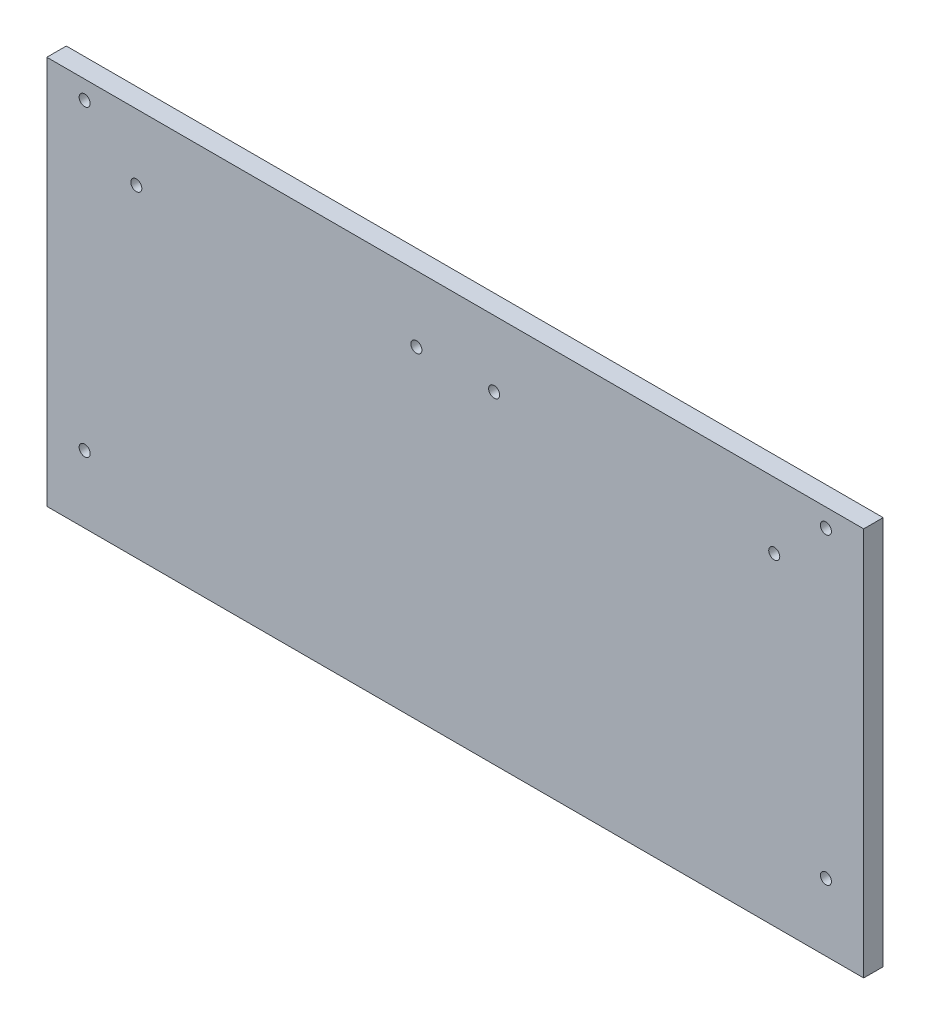
ISO-10303-21;
HEADER;
FILE_DESCRIPTION(('STEP AP214'),'2;1');
FILE_NAME('part.step','',(''),(''),'','','');
FILE_SCHEMA(('AUTOMOTIVE_DESIGN { 1 0 10303 214 1 1 1 1 }'));
ENDSEC;
DATA;
#1=APPLICATION_CONTEXT('core data for automotive mechanical design processes');
#2=APPLICATION_PROTOCOL_DEFINITION('international standard','automotive_design',2000,#1);
#3=PRODUCT_CONTEXT('',#1,'mechanical');
#4=PRODUCT('Part','Part','',(#3));
#5=PRODUCT_RELATED_PRODUCT_CATEGORY('part','',(#4));
#6=PRODUCT_DEFINITION_FORMATION('','',#4);
#7=PRODUCT_DEFINITION_CONTEXT('part definition',#1,'design');
#8=PRODUCT_DEFINITION('design','',#6,#7);
#9=PRODUCT_DEFINITION_SHAPE('','',#8);
#10=(LENGTH_UNIT() NAMED_UNIT(*) SI_UNIT(.MILLI.,.METRE.));
#11=(NAMED_UNIT(*) PLANE_ANGLE_UNIT() SI_UNIT($,.RADIAN.));
#12=(NAMED_UNIT(*) SI_UNIT($,.STERADIAN.) SOLID_ANGLE_UNIT());
#13=UNCERTAINTY_MEASURE_WITH_UNIT(LENGTH_MEASURE(1.E-05),#10,'distance_accuracy_value','');
#14=(GEOMETRIC_REPRESENTATION_CONTEXT(3) GLOBAL_UNCERTAINTY_ASSIGNED_CONTEXT((#13)) GLOBAL_UNIT_ASSIGNED_CONTEXT((#10,
#11,#12)) REPRESENTATION_CONTEXT('',''));
#15=CARTESIAN_POINT('',(0.,0.,0.));
#16=DIRECTION('',(0.,0.,1.));
#17=DIRECTION('',(1.,0.,0.));
#18=AXIS2_PLACEMENT_3D('',#15,#16,#17);
#19=CARTESIAN_POINT('',(0.,0.,0.));
#20=DIRECTION('',(0.,0.,-1.));
#21=DIRECTION('',(-1.,0.,0.));
#22=AXIS2_PLACEMENT_3D('',#19,#20,#21);
#23=PLANE('',#22);
#24=CARTESIAN_POINT('',(146.05,105.41,0.));
#25=DIRECTION('',(0.,0.,1.));
#26=DIRECTION('',(1.,0.,0.));
#27=AXIS2_PLACEMENT_3D('',#24,#25,#26);
#28=CIRCLE('',#27,1.8);
#29=CARTESIAN_POINT('',(147.85,105.41,0.));
#30=VERTEX_POINT('',#29);
#31=EDGE_CURVE('E144',#30,#30,#28,.T.);
#32=ORIENTED_EDGE('',*,*,#31,.T.);
#33=EDGE_LOOP('',(#32));
#34=FACE_BOUND('',#33,.T.);
#35=CARTESIAN_POINT('',(237.49,105.41,0.));
#36=DIRECTION('',(0.,0.,1.));
#37=DIRECTION('',(1.,0.,0.));
#38=AXIS2_PLACEMENT_3D('',#35,#36,#37);
#39=CIRCLE('',#38,1.8);
#40=CARTESIAN_POINT('',(239.29,105.41,0.));
#41=VERTEX_POINT('',#40);
#42=EDGE_CURVE('E138',#41,#41,#39,.T.);
#43=ORIENTED_EDGE('',*,*,#42,.T.);
#44=EDGE_LOOP('',(#43));
#45=FACE_BOUND('',#44,.T.);
#46=CARTESIAN_POINT('',(12.3444,121.0056,0.));
#47=DIRECTION('',(0.,0.,1.));
#48=DIRECTION('',(1.,0.,0.));
#49=AXIS2_PLACEMENT_3D('',#46,#47,#48);
#50=CIRCLE('',#49,1.8);
#51=CARTESIAN_POINT('',(14.1444,121.0056,0.));
#52=VERTEX_POINT('',#51);
#53=EDGE_CURVE('E132',#52,#52,#50,.T.);
#54=ORIENTED_EDGE('',*,*,#53,.T.);
#55=EDGE_LOOP('',(#54));
#56=FACE_BOUND('',#55,.T.);
#57=CARTESIAN_POINT('',(12.3444,21.9964,0.));
#58=DIRECTION('',(0.,0.,1.));
#59=DIRECTION('',(1.,0.,0.));
#60=AXIS2_PLACEMENT_3D('',#57,#58,#59);
#61=CIRCLE('',#60,1.8);
#62=CARTESIAN_POINT('',(14.1444,21.9964,0.));
#63=VERTEX_POINT('',#62);
#64=EDGE_CURVE('E126',#63,#63,#61,.T.);
#65=ORIENTED_EDGE('',*,*,#64,.T.);
#66=EDGE_LOOP('',(#65));
#67=FACE_BOUND('',#66,.T.);
#68=CARTESIAN_POINT('',(254.3556,21.9964,0.));
#69=DIRECTION('',(0.,0.,1.));
#70=DIRECTION('',(1.,0.,0.));
#71=AXIS2_PLACEMENT_3D('',#68,#69,#70);
#72=CIRCLE('',#71,1.80000000000002);
#73=CARTESIAN_POINT('',(256.1556,21.9964,0.));
#74=VERTEX_POINT('',#73);
#75=EDGE_CURVE('E120',#74,#74,#72,.T.);
#76=ORIENTED_EDGE('',*,*,#75,.T.);
#77=EDGE_LOOP('',(#76));
#78=FACE_BOUND('',#77,.T.);
#79=CARTESIAN_POINT('',(254.3556,121.0056,0.));
#80=DIRECTION('',(0.,0.,1.));
#81=DIRECTION('',(1.,0.,0.));
#82=AXIS2_PLACEMENT_3D('',#79,#80,#81);
#83=CIRCLE('',#82,1.80000000000002);
#84=CARTESIAN_POINT('',(256.1556,121.0056,0.));
#85=VERTEX_POINT('',#84);
#86=EDGE_CURVE('E104',#85,#85,#83,.T.);
#87=ORIENTED_EDGE('',*,*,#86,.T.);
#88=EDGE_LOOP('',(#87));
#89=FACE_BOUND('',#88,.T.);
#90=DIRECTION('',(0.,-1.,0.));
#91=VECTOR('',#90,1.);
#92=CARTESIAN_POINT('',(0.,127.,0.));
#93=LINE('',#92,#91);
#94=CARTESIAN_POINT('',(0.,127.,0.));
#95=VERTEX_POINT('',#94);
#96=CARTESIAN_POINT('',(0.,0.,0.));
#97=VERTEX_POINT('',#96);
#98=EDGE_CURVE('E101',#95,#97,#93,.T.);
#99=ORIENTED_EDGE('',*,*,#98,.F.);
#100=DIRECTION('',(-1.,0.,0.));
#101=VECTOR('',#100,1.);
#102=CARTESIAN_POINT('',(266.7,127.,0.));
#103=LINE('',#102,#101);
#104=CARTESIAN_POINT('',(266.7,127.,0.));
#105=VERTEX_POINT('',#104);
#106=EDGE_CURVE('E76',#105,#95,#103,.T.);
#107=ORIENTED_EDGE('',*,*,#106,.F.);
#108=DIRECTION('',(0.,1.,0.));
#109=VECTOR('',#108,1.);
#110=CARTESIAN_POINT('',(266.7,127.,0.));
#111=LINE('',#110,#109);
#112=CARTESIAN_POINT('',(266.7,0.,0.));
#113=VERTEX_POINT('',#112);
#114=EDGE_CURVE('E70',#113,#105,#111,.T.);
#115=ORIENTED_EDGE('',*,*,#114,.F.);
#116=DIRECTION('',(1.,0.,0.));
#117=VECTOR('',#116,1.);
#118=CARTESIAN_POINT('',(266.7,0.,0.));
#119=LINE('',#118,#117);
#120=EDGE_CURVE('E93',#97,#113,#119,.T.);
#121=ORIENTED_EDGE('',*,*,#120,.F.);
#122=EDGE_LOOP('',(#99,#107,#115,#121));
#123=FACE_BOUND('',#122,.T.);
#124=CARTESIAN_POINT('',(120.65,105.41,0.));
#125=DIRECTION('',(0.,0.,1.));
#126=DIRECTION('',(1.,0.,0.));
#127=AXIS2_PLACEMENT_3D('',#124,#125,#126);
#128=CIRCLE('',#127,1.8);
#129=CARTESIAN_POINT('',(122.45,105.41,0.));
#130=VERTEX_POINT('',#129);
#131=EDGE_CURVE('E150',#130,#130,#128,.T.);
#132=ORIENTED_EDGE('',*,*,#131,.T.);
#133=EDGE_LOOP('',(#132));
#134=FACE_BOUND('',#133,.T.);
#135=CARTESIAN_POINT('',(29.21,105.41,0.));
#136=DIRECTION('',(0.,0.,1.));
#137=DIRECTION('',(1.,0.,0.));
#138=AXIS2_PLACEMENT_3D('',#135,#136,#137);
#139=CIRCLE('',#138,1.8);
#140=CARTESIAN_POINT('',(31.01,105.41,0.));
#141=VERTEX_POINT('',#140);
#142=EDGE_CURVE('E156',#141,#141,#139,.T.);
#143=ORIENTED_EDGE('',*,*,#142,.T.);
#144=EDGE_LOOP('',(#143));
#145=FACE_BOUND('',#144,.T.);
#146=ADVANCED_FACE('F36',(#34,#45,#56,#67,#78,#89,#123,#134,#145),#23,.T.);
#147=CARTESIAN_POINT('',(0.,0.,6.35));
#148=DIRECTION('',(0.,0.,-1.));
#149=DIRECTION('',(-1.,0.,0.));
#150=AXIS2_PLACEMENT_3D('',#147,#148,#149);
#151=PLANE('',#150);
#152=CARTESIAN_POINT('',(29.21,105.41,6.35));
#153=DIRECTION('',(0.,0.,1.));
#154=DIRECTION('',(1.,0.,0.));
#155=AXIS2_PLACEMENT_3D('',#152,#153,#154);
#156=CIRCLE('',#155,1.79999999999999);
#157=CARTESIAN_POINT('',(31.01,105.41,6.35));
#158=VERTEX_POINT('',#157);
#159=EDGE_CURVE('E159',#158,#158,#156,.T.);
#160=ORIENTED_EDGE('',*,*,#159,.F.);
#161=EDGE_LOOP('',(#160));
#162=FACE_BOUND('',#161,.T.);
#163=CARTESIAN_POINT('',(146.05,105.41,6.35));
#164=DIRECTION('',(0.,0.,1.));
#165=DIRECTION('',(1.,0.,0.));
#166=AXIS2_PLACEMENT_3D('',#163,#164,#165);
#167=CIRCLE('',#166,1.8);
#168=CARTESIAN_POINT('',(147.85,105.41,6.35));
#169=VERTEX_POINT('',#168);
#170=EDGE_CURVE('E147',#169,#169,#167,.T.);
#171=ORIENTED_EDGE('',*,*,#170,.F.);
#172=EDGE_LOOP('',(#171));
#173=FACE_BOUND('',#172,.T.);
#174=CARTESIAN_POINT('',(237.49,105.41,6.35));
#175=DIRECTION('',(0.,0.,1.));
#176=DIRECTION('',(1.,0.,0.));
#177=AXIS2_PLACEMENT_3D('',#174,#175,#176);
#178=CIRCLE('',#177,1.8);
#179=CARTESIAN_POINT('',(239.29,105.41,6.35));
#180=VERTEX_POINT('',#179);
#181=EDGE_CURVE('E141',#180,#180,#178,.T.);
#182=ORIENTED_EDGE('',*,*,#181,.F.);
#183=EDGE_LOOP('',(#182));
#184=FACE_BOUND('',#183,.T.);
#185=CARTESIAN_POINT('',(12.3444,121.0056,6.35));
#186=DIRECTION('',(0.,0.,1.));
#187=DIRECTION('',(1.,0.,0.));
#188=AXIS2_PLACEMENT_3D('',#185,#186,#187);
#189=CIRCLE('',#188,1.8);
#190=CARTESIAN_POINT('',(14.1444,121.0056,6.35));
#191=VERTEX_POINT('',#190);
#192=EDGE_CURVE('E135',#191,#191,#189,.T.);
#193=ORIENTED_EDGE('',*,*,#192,.F.);
#194=EDGE_LOOP('',(#193));
#195=FACE_BOUND('',#194,.T.);
#196=CARTESIAN_POINT('',(12.3444,21.9964,6.35));
#197=DIRECTION('',(0.,0.,1.));
#198=DIRECTION('',(1.,0.,0.));
#199=AXIS2_PLACEMENT_3D('',#196,#197,#198);
#200=CIRCLE('',#199,1.8);
#201=CARTESIAN_POINT('',(14.1444,21.9964,6.35));
#202=VERTEX_POINT('',#201);
#203=EDGE_CURVE('E129',#202,#202,#200,.T.);
#204=ORIENTED_EDGE('',*,*,#203,.F.);
#205=EDGE_LOOP('',(#204));
#206=FACE_BOUND('',#205,.T.);
#207=CARTESIAN_POINT('',(254.3556,21.9964,6.35));
#208=DIRECTION('',(0.,0.,1.));
#209=DIRECTION('',(1.,0.,0.));
#210=AXIS2_PLACEMENT_3D('',#207,#208,#209);
#211=CIRCLE('',#210,1.80000000000002);
#212=CARTESIAN_POINT('',(256.1556,21.9964,6.35));
#213=VERTEX_POINT('',#212);
#214=EDGE_CURVE('E123',#213,#213,#211,.T.);
#215=ORIENTED_EDGE('',*,*,#214,.F.);
#216=EDGE_LOOP('',(#215));
#217=FACE_BOUND('',#216,.T.);
#218=CARTESIAN_POINT('',(254.3556,121.0056,6.35));
#219=DIRECTION('',(0.,0.,1.));
#220=DIRECTION('',(1.,0.,0.));
#221=AXIS2_PLACEMENT_3D('',#218,#219,#220);
#222=CIRCLE('',#221,1.80000000000002);
#223=CARTESIAN_POINT('',(256.1556,121.0056,6.35));
#224=VERTEX_POINT('',#223);
#225=EDGE_CURVE('E117',#224,#224,#222,.T.);
#226=ORIENTED_EDGE('',*,*,#225,.F.);
#227=EDGE_LOOP('',(#226));
#228=FACE_BOUND('',#227,.T.);
#229=DIRECTION('',(0.,-1.,0.));
#230=VECTOR('',#229,1.);
#231=CARTESIAN_POINT('',(0.,127.,6.35));
#232=LINE('',#231,#230);
#233=CARTESIAN_POINT('',(0.,127.,6.35));
#234=VERTEX_POINT('',#233);
#235=CARTESIAN_POINT('',(0.,0.,6.35));
#236=VERTEX_POINT('',#235);
#237=EDGE_CURVE('E89',#234,#236,#232,.T.);
#238=ORIENTED_EDGE('',*,*,#237,.T.);
#239=DIRECTION('',(1.,0.,0.));
#240=VECTOR('',#239,1.);
#241=CARTESIAN_POINT('',(266.7,0.,6.35));
#242=LINE('',#241,#240);
#243=CARTESIAN_POINT('',(266.7,0.,6.35));
#244=VERTEX_POINT('',#243);
#245=EDGE_CURVE('E83',#236,#244,#242,.T.);
#246=ORIENTED_EDGE('',*,*,#245,.T.);
#247=DIRECTION('',(0.,1.,0.));
#248=VECTOR('',#247,1.);
#249=CARTESIAN_POINT('',(266.7,127.,6.35));
#250=LINE('',#249,#248);
#251=CARTESIAN_POINT('',(266.7,127.,6.35));
#252=VERTEX_POINT('',#251);
#253=EDGE_CURVE('E87',#244,#252,#250,.T.);
#254=ORIENTED_EDGE('',*,*,#253,.T.);
#255=DIRECTION('',(-1.,0.,0.));
#256=VECTOR('',#255,1.);
#257=CARTESIAN_POINT('',(266.7,127.,6.35));
#258=LINE('',#257,#256);
#259=EDGE_CURVE('E53',#252,#234,#258,.T.);
#260=ORIENTED_EDGE('',*,*,#259,.T.);
#261=EDGE_LOOP('',(#238,#246,#254,#260));
#262=FACE_BOUND('',#261,.T.);
#263=CARTESIAN_POINT('',(120.65,105.41,6.35));
#264=DIRECTION('',(0.,0.,1.));
#265=DIRECTION('',(1.,0.,0.));
#266=AXIS2_PLACEMENT_3D('',#263,#264,#265);
#267=CIRCLE('',#266,1.79999999999998);
#268=CARTESIAN_POINT('',(122.45,105.41,6.35));
#269=VERTEX_POINT('',#268);
#270=EDGE_CURVE('E153',#269,#269,#267,.T.);
#271=ORIENTED_EDGE('',*,*,#270,.F.);
#272=EDGE_LOOP('',(#271));
#273=FACE_BOUND('',#272,.T.);
#274=ADVANCED_FACE('F84',(#162,#173,#184,#195,#206,#217,#228,#262,#273),#151,.F.);
#275=CARTESIAN_POINT('',(0.,127.,6.35));
#276=DIRECTION('',(1.,0.,0.));
#277=DIRECTION('',(0.,1.,0.));
#278=AXIS2_PLACEMENT_3D('',#275,#276,#277);
#279=PLANE('',#278);
#280=ORIENTED_EDGE('',*,*,#98,.T.);
#281=DIRECTION('',(0.,0.,-1.));
#282=VECTOR('',#281,1.);
#283=CARTESIAN_POINT('',(0.,0.,6.35));
#284=LINE('',#283,#282);
#285=EDGE_CURVE('E11',#236,#97,#284,.T.);
#286=ORIENTED_EDGE('',*,*,#285,.F.);
#287=ORIENTED_EDGE('',*,*,#237,.F.);
#288=DIRECTION('',(0.,0.,-1.));
#289=VECTOR('',#288,1.);
#290=CARTESIAN_POINT('',(0.,127.,6.35));
#291=LINE('',#290,#289);
#292=EDGE_CURVE('E97',#234,#95,#291,.T.);
#293=ORIENTED_EDGE('',*,*,#292,.T.);
#294=EDGE_LOOP('',(#280,#286,#287,#293));
#295=FACE_BOUND('',#294,.T.);
#296=ADVANCED_FACE('F38',(#295),#279,.F.);
#297=CARTESIAN_POINT('',(266.7,0.,6.35));
#298=DIRECTION('',(0.,1.,0.));
#299=DIRECTION('',(-1.,0.,0.));
#300=AXIS2_PLACEMENT_3D('',#297,#298,#299);
#301=PLANE('',#300);
#302=ORIENTED_EDGE('',*,*,#120,.T.);
#303=DIRECTION('',(0.,0.,-1.));
#304=VECTOR('',#303,1.);
#305=CARTESIAN_POINT('',(266.7,0.,6.35));
#306=LINE('',#305,#304);
#307=EDGE_CURVE('E45',#244,#113,#306,.T.);
#308=ORIENTED_EDGE('',*,*,#307,.F.);
#309=ORIENTED_EDGE('',*,*,#245,.F.);
#310=ORIENTED_EDGE('',*,*,#285,.T.);
#311=EDGE_LOOP('',(#302,#308,#309,#310));
#312=FACE_BOUND('',#311,.T.);
#313=ADVANCED_FACE('F92',(#312),#301,.F.);
#314=CARTESIAN_POINT('',(266.7,127.,6.35));
#315=DIRECTION('',(-1.,0.,0.));
#316=DIRECTION('',(0.,0.,1.));
#317=AXIS2_PLACEMENT_3D('',#314,#315,#316);
#318=PLANE('',#317);
#319=ORIENTED_EDGE('',*,*,#114,.T.);
#320=DIRECTION('',(0.,0.,-1.));
#321=VECTOR('',#320,1.);
#322=CARTESIAN_POINT('',(266.7,127.,6.35));
#323=LINE('',#322,#321);
#324=EDGE_CURVE('E94',#252,#105,#323,.T.);
#325=ORIENTED_EDGE('',*,*,#324,.F.);
#326=ORIENTED_EDGE('',*,*,#253,.F.);
#327=ORIENTED_EDGE('',*,*,#307,.T.);
#328=EDGE_LOOP('',(#319,#325,#326,#327));
#329=FACE_BOUND('',#328,.T.);
#330=ADVANCED_FACE('F95',(#329),#318,.F.);
#331=CARTESIAN_POINT('',(266.7,127.,6.35));
#332=DIRECTION('',(0.,-1.,0.));
#333=DIRECTION('',(1.,0.,0.));
#334=AXIS2_PLACEMENT_3D('',#331,#332,#333);
#335=PLANE('',#334);
#336=ORIENTED_EDGE('',*,*,#106,.T.);
#337=ORIENTED_EDGE('',*,*,#292,.F.);
#338=ORIENTED_EDGE('',*,*,#259,.F.);
#339=ORIENTED_EDGE('',*,*,#324,.T.);
#340=EDGE_LOOP('',(#336,#337,#338,#339));
#341=FACE_BOUND('',#340,.T.);
#342=ADVANCED_FACE('F109',(#341),#335,.F.);
#343=CARTESIAN_POINT('',(254.3556,121.0056,6.35));
#344=DIRECTION('',(0.,0.,1.));
#345=DIRECTION('',(1.,0.,0.));
#346=AXIS2_PLACEMENT_3D('',#343,#344,#345);
#347=CYLINDRICAL_SURFACE('',#346,1.80000000000002);
#348=ORIENTED_EDGE('',*,*,#86,.F.);
#349=EDGE_LOOP('',(#348));
#350=FACE_BOUND('',#349,.T.);
#351=ORIENTED_EDGE('',*,*,#225,.T.);
#352=EDGE_LOOP('',(#351));
#353=FACE_BOUND('',#352,.T.);
#354=ADVANCED_FACE('F180',(#350,#353),#347,.F.);
#355=CARTESIAN_POINT('',(254.3556,21.9964,6.35));
#356=DIRECTION('',(0.,0.,1.));
#357=DIRECTION('',(1.,0.,0.));
#358=AXIS2_PLACEMENT_3D('',#355,#356,#357);
#359=CYLINDRICAL_SURFACE('',#358,1.80000000000002);
#360=ORIENTED_EDGE('',*,*,#75,.F.);
#361=EDGE_LOOP('',(#360));
#362=FACE_BOUND('',#361,.T.);
#363=ORIENTED_EDGE('',*,*,#214,.T.);
#364=EDGE_LOOP('',(#363));
#365=FACE_BOUND('',#364,.T.);
#366=ADVANCED_FACE('F182',(#362,#365),#359,.F.);
#367=CARTESIAN_POINT('',(12.3444,21.9964,6.35));
#368=DIRECTION('',(0.,0.,1.));
#369=DIRECTION('',(1.,0.,0.));
#370=AXIS2_PLACEMENT_3D('',#367,#368,#369);
#371=CYLINDRICAL_SURFACE('',#370,1.8);
#372=ORIENTED_EDGE('',*,*,#64,.F.);
#373=EDGE_LOOP('',(#372));
#374=FACE_BOUND('',#373,.T.);
#375=ORIENTED_EDGE('',*,*,#203,.T.);
#376=EDGE_LOOP('',(#375));
#377=FACE_BOUND('',#376,.T.);
#378=ADVANCED_FACE('F189',(#374,#377),#371,.F.);
#379=CARTESIAN_POINT('',(12.3444,121.0056,6.35));
#380=DIRECTION('',(0.,0.,1.));
#381=DIRECTION('',(1.,0.,0.));
#382=AXIS2_PLACEMENT_3D('',#379,#380,#381);
#383=CYLINDRICAL_SURFACE('',#382,1.8);
#384=ORIENTED_EDGE('',*,*,#53,.F.);
#385=EDGE_LOOP('',(#384));
#386=FACE_BOUND('',#385,.T.);
#387=ORIENTED_EDGE('',*,*,#192,.T.);
#388=EDGE_LOOP('',(#387));
#389=FACE_BOUND('',#388,.T.);
#390=ADVANCED_FACE('F249',(#386,#389),#383,.F.);
#391=CARTESIAN_POINT('',(237.49,105.41,6.35));
#392=DIRECTION('',(0.,0.,1.));
#393=DIRECTION('',(1.,0.,0.));
#394=AXIS2_PLACEMENT_3D('',#391,#392,#393);
#395=CYLINDRICAL_SURFACE('',#394,1.8);
#396=ORIENTED_EDGE('',*,*,#42,.F.);
#397=EDGE_LOOP('',(#396));
#398=FACE_BOUND('',#397,.T.);
#399=ORIENTED_EDGE('',*,*,#181,.T.);
#400=EDGE_LOOP('',(#399));
#401=FACE_BOUND('',#400,.T.);
#402=ADVANCED_FACE('F259',(#398,#401),#395,.F.);
#403=CARTESIAN_POINT('',(146.05,105.41,6.35));
#404=DIRECTION('',(0.,0.,1.));
#405=DIRECTION('',(1.,0.,0.));
#406=AXIS2_PLACEMENT_3D('',#403,#404,#405);
#407=CYLINDRICAL_SURFACE('',#406,1.8);
#408=ORIENTED_EDGE('',*,*,#31,.F.);
#409=EDGE_LOOP('',(#408));
#410=FACE_BOUND('',#409,.T.);
#411=ORIENTED_EDGE('',*,*,#170,.T.);
#412=EDGE_LOOP('',(#411));
#413=FACE_BOUND('',#412,.T.);
#414=ADVANCED_FACE('F282',(#410,#413),#407,.F.);
#415=CARTESIAN_POINT('',(120.65,105.41,6.35));
#416=DIRECTION('',(0.,0.,1.));
#417=DIRECTION('',(1.,0.,0.));
#418=AXIS2_PLACEMENT_3D('',#415,#416,#417);
#419=CYLINDRICAL_SURFACE('',#418,1.79999999999999);
#420=ORIENTED_EDGE('',*,*,#131,.F.);
#421=EDGE_LOOP('',(#420));
#422=FACE_BOUND('',#421,.T.);
#423=ORIENTED_EDGE('',*,*,#270,.T.);
#424=EDGE_LOOP('',(#423));
#425=FACE_BOUND('',#424,.T.);
#426=ADVANCED_FACE('F289',(#422,#425),#419,.F.);
#427=CARTESIAN_POINT('',(29.21,105.41,6.35));
#428=DIRECTION('',(0.,0.,1.));
#429=DIRECTION('',(1.,0.,0.));
#430=AXIS2_PLACEMENT_3D('',#427,#428,#429);
#431=CYLINDRICAL_SURFACE('',#430,1.79999999999999);
#432=ORIENTED_EDGE('',*,*,#142,.F.);
#433=EDGE_LOOP('',(#432));
#434=FACE_BOUND('',#433,.T.);
#435=ORIENTED_EDGE('',*,*,#159,.T.);
#436=EDGE_LOOP('',(#435));
#437=FACE_BOUND('',#436,.T.);
#438=ADVANCED_FACE('F163',(#434,#437),#431,.F.);
#439=CLOSED_SHELL('',(#146,#274,#296,#313,#330,#342,#354,#366,#378,#390,#402,#414,#426,#438));
#440=MANIFOLD_SOLID_BREP('B2',#439);
#441=ADVANCED_BREP_SHAPE_REPRESENTATION('',(#18,#440),#14);
#442=SHAPE_DEFINITION_REPRESENTATION(#9,#441);
ENDSEC;
END-ISO-10303-21;
